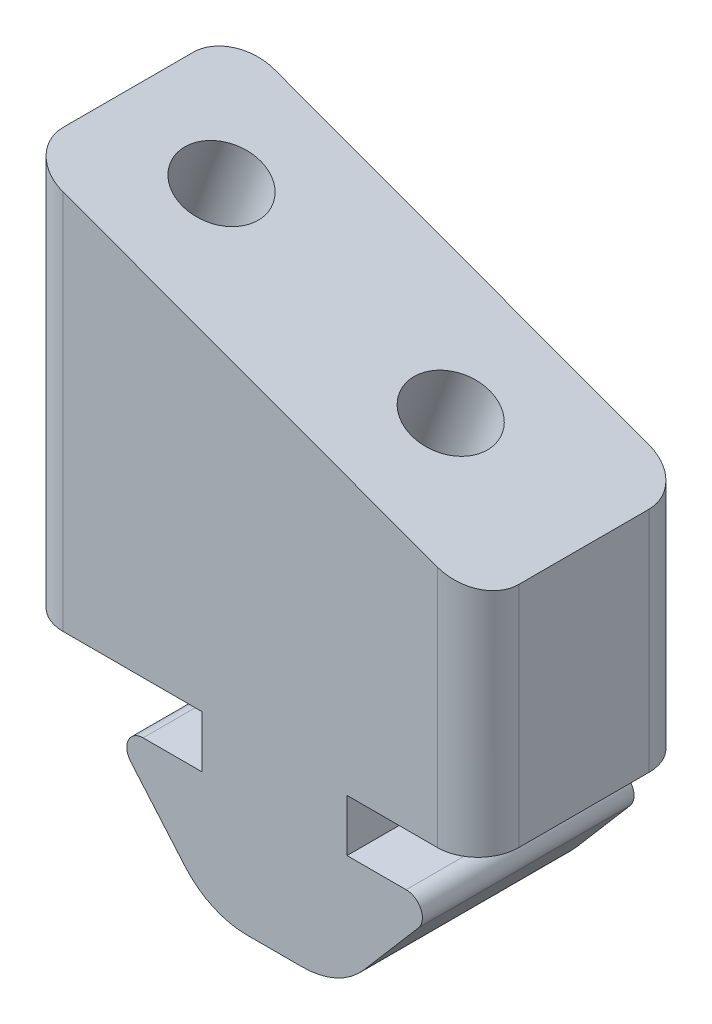
ISO-10303-21;
HEADER;
FILE_DESCRIPTION(('STEP AP214'),'2;1');
FILE_NAME('part.step','',(''),(''),'','','');
FILE_SCHEMA(('AUTOMOTIVE_DESIGN { 1 0 10303 214 1 1 1 1 }'));
ENDSEC;
DATA;
#1=APPLICATION_CONTEXT('core data for automotive mechanical design processes');
#2=APPLICATION_PROTOCOL_DEFINITION('international standard','automotive_design',2000,#1);
#3=PRODUCT_CONTEXT('',#1,'mechanical');
#4=PRODUCT('Part','Part','',(#3));
#5=PRODUCT_RELATED_PRODUCT_CATEGORY('part','',(#4));
#6=PRODUCT_DEFINITION_FORMATION('','',#4);
#7=PRODUCT_DEFINITION_CONTEXT('part definition',#1,'design');
#8=PRODUCT_DEFINITION('design','',#6,#7);
#9=PRODUCT_DEFINITION_SHAPE('','',#8);
#10=(LENGTH_UNIT() NAMED_UNIT(*) SI_UNIT(.MILLI.,.METRE.));
#11=(NAMED_UNIT(*) PLANE_ANGLE_UNIT() SI_UNIT($,.RADIAN.));
#12=(NAMED_UNIT(*) SI_UNIT($,.STERADIAN.) SOLID_ANGLE_UNIT());
#13=UNCERTAINTY_MEASURE_WITH_UNIT(LENGTH_MEASURE(1.E-05),#10,'distance_accuracy_value','');
#14=(GEOMETRIC_REPRESENTATION_CONTEXT(3) GLOBAL_UNCERTAINTY_ASSIGNED_CONTEXT((#13)) GLOBAL_UNIT_ASSIGNED_CONTEXT((#10,
#11,#12)) REPRESENTATION_CONTEXT('',''));
#15=CARTESIAN_POINT('',(0.,0.,0.));
#16=DIRECTION('',(0.,0.,1.));
#17=DIRECTION('',(1.,0.,0.));
#18=AXIS2_PLACEMENT_3D('',#15,#16,#17);
#19=CARTESIAN_POINT('',(12.5,0.,13.));
#20=DIRECTION('',(1.,0.,0.));
#21=DIRECTION('',(0.,1.,0.));
#22=AXIS2_PLACEMENT_3D('',#19,#20,#21);
#23=PLANE('',#22);
#24=DIRECTION('',(0.,0.,-1.));
#25=VECTOR('',#24,1.);
#26=CARTESIAN_POINT('',(12.5,10.5,13.));
#27=LINE('',#26,#25);
#28=CARTESIAN_POINT('',(12.5,10.5,10.5));
#29=VERTEX_POINT('',#28);
#30=CARTESIAN_POINT('',(12.5,10.5,2.5));
#31=VERTEX_POINT('',#30);
#32=EDGE_CURVE('E246',#29,#31,#27,.T.);
#33=ORIENTED_EDGE('',*,*,#32,.T.);
#34=DIRECTION('',(0.,-1.,0.));
#35=VECTOR('',#34,1.);
#36=CARTESIAN_POINT('',(12.5,24.5,2.5));
#37=LINE('',#36,#35);
#38=CARTESIAN_POINT('',(12.5,24.5,2.5));
#39=VERTEX_POINT('',#38);
#40=EDGE_CURVE('E11',#31,#39,#37,.F.);
#41=ORIENTED_EDGE('',*,*,#40,.T.);
#42=DIRECTION('',(0.,0.,-1.));
#43=VECTOR('',#42,1.);
#44=CARTESIAN_POINT('',(12.5,24.5,13.));
#45=LINE('',#44,#43);
#46=CARTESIAN_POINT('',(12.5,24.5,10.5));
#47=VERTEX_POINT('',#46);
#48=EDGE_CURVE('E260',#47,#39,#45,.T.);
#49=ORIENTED_EDGE('',*,*,#48,.F.);
#50=DIRECTION('',(0.,-1.,0.));
#51=VECTOR('',#50,1.);
#52=CARTESIAN_POINT('',(12.5,0.,10.5));
#53=LINE('',#52,#51);
#54=EDGE_CURVE('E49',#47,#29,#53,.T.);
#55=ORIENTED_EDGE('',*,*,#54,.T.);
#56=EDGE_LOOP('',(#33,#41,#49,#55));
#57=FACE_BOUND('',#56,.T.);
#58=ADVANCED_FACE('F41',(#57),#23,.T.);
#59=CARTESIAN_POINT('',(9.43154275407249,25.6291922665013,13.));
#60=DIRECTION('',(0.345357414020893,0.938471233752426,0.));
#61=DIRECTION('',(-0.938471233752427,0.345357414020893,0.));
#62=AXIS2_PLACEMENT_3D('',#59,#60,#61);
#63=PLANE('',#62);
#64=CARTESIAN_POINT('',(-9.76024639637212,32.6917706738649,6.5));
#65=DIRECTION('',(0.345357414020893,0.938471233752427,0.));
#66=DIRECTION('',(-0.938471233752427,0.345357414020893,0.));
#67=AXIS2_PLACEMENT_3D('',#64,#65,#66);
#68=CIRCLE('',#67,2.4);
#69=CARTESIAN_POINT('',(-12.0125773573779,33.5206284675151,6.5));
#70=VERTEX_POINT('',#69);
#71=EDGE_CURVE('E349',#70,#70,#68,.T.);
#72=ORIENTED_EDGE('',*,*,#71,.F.);
#73=EDGE_LOOP('',(#72));
#74=FACE_BOUND('',#73,.T.);
#75=CARTESIAN_POINT('',(4.31682210991428,27.5114094635516,6.5));
#76=DIRECTION('',(0.345357414020893,0.938471233752427,0.));
#77=DIRECTION('',(-0.938471233752427,0.345357414020893,0.));
#78=AXIS2_PLACEMENT_3D('',#75,#76,#77);
#79=CIRCLE('',#78,2.4);
#80=CARTESIAN_POINT('',(2.06449114890845,28.3402672572017,6.5));
#81=VERTEX_POINT('',#80);
#82=EDGE_CURVE('E346',#81,#81,#79,.T.);
#83=ORIENTED_EDGE('',*,*,#82,.F.);
#84=EDGE_LOOP('',(#83));
#85=FACE_BOUND('',#84,.T.);
#86=DIRECTION('',(0.,0.,-1.));
#87=VECTOR('',#86,1.);
#88=CARTESIAN_POINT('',(-15.5,34.804,13.));
#89=LINE('',#88,#87);
#90=CARTESIAN_POINT('',(-15.5,34.804,10.5));
#91=VERTEX_POINT('',#90);
#92=CARTESIAN_POINT('',(-15.5,34.804,2.5));
#93=VERTEX_POINT('',#92);
#94=EDGE_CURVE('E257',#91,#93,#89,.T.);
#95=ORIENTED_EDGE('',*,*,#94,.F.);
#96=CARTESIAN_POINT('',(-13.,33.884,10.5));
#97=DIRECTION('',(0.345357414020893,0.938471233752426,0.));
#98=DIRECTION('',(-0.938471233752427,0.345357414020893,0.));
#99=AXIS2_PLACEMENT_3D('',#96,#97,#98);
#100=ELLIPSE('',#99,2.66390690528029,2.5);
#101=CARTESIAN_POINT('',(-13.,33.884,13.));
#102=VERTEX_POINT('',#101);
#103=EDGE_CURVE('E312',#91,#102,#100,.T.);
#104=ORIENTED_EDGE('',*,*,#103,.T.);
#105=DIRECTION('',(0.938471233752427,-0.345357414020893,0.));
#106=VECTOR('',#105,1.);
#107=CARTESIAN_POINT('',(9.43154275407249,25.6291922665013,13.));
#108=LINE('',#107,#106);
#109=CARTESIAN_POINT('',(10.,25.42,13.));
#110=VERTEX_POINT('',#109);
#111=EDGE_CURVE('E190',#102,#110,#108,.T.);
#112=ORIENTED_EDGE('',*,*,#111,.T.);
#113=CARTESIAN_POINT('',(10.,25.42,10.5));
#114=DIRECTION('',(0.345357414020893,0.938471233752426,0.));
#115=DIRECTION('',(0.938471233752427,-0.345357414020893,0.));
#116=AXIS2_PLACEMENT_3D('',#113,#114,#115);
#117=ELLIPSE('',#116,2.66390690528029,2.5);
#118=EDGE_CURVE('E306',#110,#47,#117,.T.);
#119=ORIENTED_EDGE('',*,*,#118,.T.);
#120=ORIENTED_EDGE('',*,*,#48,.T.);
#121=CARTESIAN_POINT('',(10.,25.42,2.5));
#122=DIRECTION('',(0.345357414020893,0.938471233752426,0.));
#123=DIRECTION('',(-0.938471233752427,0.345357414020893,0.));
#124=AXIS2_PLACEMENT_3D('',#121,#122,#123);
#125=ELLIPSE('',#124,2.66390690528029,2.5);
#126=CARTESIAN_POINT('',(10.,25.42,0.));
#127=VERTEX_POINT('',#126);
#128=EDGE_CURVE('E308',#39,#127,#125,.T.);
#129=ORIENTED_EDGE('',*,*,#128,.T.);
#130=DIRECTION('',(0.938471233752427,-0.345357414020893,0.));
#131=VECTOR('',#130,1.);
#132=CARTESIAN_POINT('',(9.43154275407249,25.6291922665013,0.));
#133=LINE('',#132,#131);
#134=CARTESIAN_POINT('',(-13.,33.884,0.));
#135=VERTEX_POINT('',#134);
#136=EDGE_CURVE('E223',#135,#127,#133,.T.);
#137=ORIENTED_EDGE('',*,*,#136,.F.);
#138=CARTESIAN_POINT('',(-13.,33.884,2.5));
#139=DIRECTION('',(0.345357414020893,0.938471233752426,0.));
#140=DIRECTION('',(0.938471233752427,-0.345357414020893,0.));
#141=AXIS2_PLACEMENT_3D('',#138,#139,#140);
#142=ELLIPSE('',#141,2.66390690528029,2.5);
#143=EDGE_CURVE('E310',#135,#93,#142,.T.);
#144=ORIENTED_EDGE('',*,*,#143,.T.);
#145=EDGE_LOOP('',(#95,#104,#112,#119,#120,#129,#137,#144));
#146=FACE_BOUND('',#145,.T.);
#147=ADVANCED_FACE('F340',(#74,#85,#146),#63,.T.);
#148=CARTESIAN_POINT('',(-15.5,0.,13.));
#149=DIRECTION('',(-1.,0.,0.));
#150=DIRECTION('',(0.,0.,1.));
#151=AXIS2_PLACEMENT_3D('',#148,#149,#150);
#152=PLANE('',#151);
#153=DIRECTION('',(0.,0.,-1.));
#154=VECTOR('',#153,1.);
#155=CARTESIAN_POINT('',(-15.5,10.5,13.));
#156=LINE('',#155,#154);
#157=CARTESIAN_POINT('',(-15.5,10.5,10.5));
#158=VERTEX_POINT('',#157);
#159=CARTESIAN_POINT('',(-15.5,10.5,2.5));
#160=VERTEX_POINT('',#159);
#161=EDGE_CURVE('E200',#158,#160,#156,.T.);
#162=ORIENTED_EDGE('',*,*,#161,.F.);
#163=DIRECTION('',(0.,1.,0.));
#164=VECTOR('',#163,1.);
#165=CARTESIAN_POINT('',(-15.5,0.,10.5));
#166=LINE('',#165,#164);
#167=EDGE_CURVE('E303',#158,#91,#166,.T.);
#168=ORIENTED_EDGE('',*,*,#167,.T.);
#169=ORIENTED_EDGE('',*,*,#94,.T.);
#170=DIRECTION('',(0.,1.,0.));
#171=VECTOR('',#170,1.);
#172=CARTESIAN_POINT('',(-15.5,10.5,2.5));
#173=LINE('',#172,#171);
#174=EDGE_CURVE('E301',#93,#160,#173,.F.);
#175=ORIENTED_EDGE('',*,*,#174,.T.);
#176=EDGE_LOOP('',(#162,#168,#169,#175));
#177=FACE_BOUND('',#176,.T.);
#178=ADVANCED_FACE('F366',(#177),#152,.T.);
#179=CARTESIAN_POINT('',(0.,10.5,13.));
#180=DIRECTION('',(0.,1.,0.));
#181=DIRECTION('',(-1.,0.,0.));
#182=AXIS2_PLACEMENT_3D('',#179,#180,#181);
#183=PLANE('',#182);
#184=DIRECTION('',(1.,0.,0.));
#185=VECTOR('',#184,1.);
#186=CARTESIAN_POINT('',(0.,10.5,13.));
#187=LINE('',#186,#185);
#188=CARTESIAN_POINT('',(-13.,10.5,13.));
#189=VERTEX_POINT('',#188);
#190=CARTESIAN_POINT('',(-4.45,10.5,13.));
#191=VERTEX_POINT('',#190);
#192=EDGE_CURVE('E178',#189,#191,#187,.T.);
#193=ORIENTED_EDGE('',*,*,#192,.F.);
#194=CARTESIAN_POINT('',(-13.,10.5,10.5));
#195=DIRECTION('',(0.,1.,0.));
#196=DIRECTION('',(-1.,0.,0.));
#197=AXIS2_PLACEMENT_3D('',#194,#195,#196);
#198=CIRCLE('',#197,2.5);
#199=EDGE_CURVE('E319',#189,#158,#198,.F.);
#200=ORIENTED_EDGE('',*,*,#199,.T.);
#201=ORIENTED_EDGE('',*,*,#161,.T.);
#202=CARTESIAN_POINT('',(-13.,10.5,2.5));
#203=DIRECTION('',(0.,1.,0.));
#204=DIRECTION('',(-1.,0.,0.));
#205=AXIS2_PLACEMENT_3D('',#202,#203,#204);
#206=CIRCLE('',#205,2.5);
#207=CARTESIAN_POINT('',(-13.,10.5,0.));
#208=VERTEX_POINT('',#207);
#209=EDGE_CURVE('E317',#160,#208,#206,.F.);
#210=ORIENTED_EDGE('',*,*,#209,.T.);
#211=DIRECTION('',(1.,0.,0.));
#212=VECTOR('',#211,1.);
#213=CARTESIAN_POINT('',(0.,10.5,0.));
#214=LINE('',#213,#212);
#215=CARTESIAN_POINT('',(-4.45,10.5,0.));
#216=VERTEX_POINT('',#215);
#217=EDGE_CURVE('E197',#208,#216,#214,.T.);
#218=ORIENTED_EDGE('',*,*,#217,.T.);
#219=DIRECTION('',(0.,0.,-1.));
#220=VECTOR('',#219,1.);
#221=CARTESIAN_POINT('',(-4.45,10.5,13.));
#222=LINE('',#221,#220);
#223=EDGE_CURVE('E194',#191,#216,#222,.T.);
#224=ORIENTED_EDGE('',*,*,#223,.F.);
#225=EDGE_LOOP('',(#193,#200,#201,#210,#218,#224));
#226=FACE_BOUND('',#225,.T.);
#227=ADVANCED_FACE('F195',(#226),#183,.F.);
#228=CARTESIAN_POINT('',(-4.45,0.,13.));
#229=DIRECTION('',(1.,0.,0.));
#230=DIRECTION('',(0.,1.,0.));
#231=AXIS2_PLACEMENT_3D('',#228,#229,#230);
#232=PLANE('',#231);
#233=DIRECTION('',(0.,-1.,0.));
#234=VECTOR('',#233,1.);
#235=CARTESIAN_POINT('',(-4.45,0.,0.));
#236=LINE('',#235,#234);
#237=CARTESIAN_POINT('',(-4.45,7.3,0.));
#238=VERTEX_POINT('',#237);
#239=EDGE_CURVE('E228',#216,#238,#236,.T.);
#240=ORIENTED_EDGE('',*,*,#239,.T.);
#241=DIRECTION('',(0.,0.,-1.));
#242=VECTOR('',#241,1.);
#243=CARTESIAN_POINT('',(-4.45,7.3,13.));
#244=LINE('',#243,#242);
#245=CARTESIAN_POINT('',(-4.45,7.3,13.));
#246=VERTEX_POINT('',#245);
#247=EDGE_CURVE('E201',#246,#238,#244,.T.);
#248=ORIENTED_EDGE('',*,*,#247,.F.);
#249=DIRECTION('',(0.,-1.,0.));
#250=VECTOR('',#249,1.);
#251=CARTESIAN_POINT('',(-4.45,0.,13.));
#252=LINE('',#251,#250);
#253=EDGE_CURVE('E184',#191,#246,#252,.T.);
#254=ORIENTED_EDGE('',*,*,#253,.F.);
#255=ORIENTED_EDGE('',*,*,#223,.T.);
#256=EDGE_LOOP('',(#240,#248,#254,#255));
#257=FACE_BOUND('',#256,.T.);
#258=ADVANCED_FACE('F203',(#257),#232,.F.);
#259=CARTESIAN_POINT('',(0.,7.3,13.));
#260=DIRECTION('',(0.,-1.,0.));
#261=DIRECTION('',(1.,0.,0.));
#262=AXIS2_PLACEMENT_3D('',#259,#260,#261);
#263=PLANE('',#262);
#264=DIRECTION('',(-1.,0.,0.));
#265=VECTOR('',#264,1.);
#266=CARTESIAN_POINT('',(0.,7.3,0.));
#267=LINE('',#266,#265);
#268=CARTESIAN_POINT('',(-8.07739440936548,7.3,0.));
#269=VERTEX_POINT('',#268);
#270=EDGE_CURVE('E231',#238,#269,#267,.T.);
#271=ORIENTED_EDGE('',*,*,#270,.T.);
#272=DIRECTION('',(0.,0.,-1.));
#273=VECTOR('',#272,1.);
#274=CARTESIAN_POINT('',(-8.07739440936548,7.3,13.));
#275=LINE('',#274,#273);
#276=CARTESIAN_POINT('',(-8.07739440936548,7.3,13.));
#277=VERTEX_POINT('',#276);
#278=EDGE_CURVE('E281',#269,#277,#275,.F.);
#279=ORIENTED_EDGE('',*,*,#278,.T.);
#280=DIRECTION('',(-1.,0.,0.));
#281=VECTOR('',#280,1.);
#282=CARTESIAN_POINT('',(0.,7.3,13.));
#283=LINE('',#282,#281);
#284=EDGE_CURVE('E206',#246,#277,#283,.T.);
#285=ORIENTED_EDGE('',*,*,#284,.F.);
#286=ORIENTED_EDGE('',*,*,#247,.T.);
#287=EDGE_LOOP('',(#271,#279,#285,#286));
#288=FACE_BOUND('',#287,.T.);
#289=ADVANCED_FACE('F435',(#288),#263,.F.);
#290=CARTESIAN_POINT('',(-2.30811293684524,-1.97612408976476,13.));
#291=DIRECTION('',(0.759623745160267,0.650362795513927,0.));
#292=DIRECTION('',(-0.650362795513927,0.759623745160267,0.));
#293=AXIS2_PLACEMENT_3D('',#290,#291,#292);
#294=PLANE('',#293);
#295=DIRECTION('',(0.650362795513927,-0.759623745160267,0.));
#296=VECTOR('',#295,1.);
#297=CARTESIAN_POINT('',(-2.30811293684524,-1.97612408976476,0.));
#298=LINE('',#297,#296);
#299=CARTESIAN_POINT('',(-8.83701815452575,5.64963720448607,0.));
#300=VERTEX_POINT('',#299);
#301=CARTESIAN_POINT('',(-5.49673460824518,1.74818602243036,0.));
#302=VERTEX_POINT('',#301);
#303=EDGE_CURVE('E234',#300,#302,#298,.T.);
#304=ORIENTED_EDGE('',*,*,#303,.T.);
#305=DIRECTION('',(0.,0.,-1.));
#306=VECTOR('',#305,1.);
#307=CARTESIAN_POINT('',(-5.49673460824518,1.74818602243036,13.));
#308=LINE('',#307,#306);
#309=CARTESIAN_POINT('',(-5.49673460824518,1.74818602243036,13.));
#310=VERTEX_POINT('',#309);
#311=EDGE_CURVE('E299',#302,#310,#308,.F.);
#312=ORIENTED_EDGE('',*,*,#311,.T.);
#313=DIRECTION('',(0.650362795513927,-0.759623745160267,0.));
#314=VECTOR('',#313,1.);
#315=CARTESIAN_POINT('',(-2.30811293684524,-1.97612408976476,13.));
#316=LINE('',#315,#314);
#317=CARTESIAN_POINT('',(-8.83701815452575,5.64963720448607,13.));
#318=VERTEX_POINT('',#317);
#319=EDGE_CURVE('E208',#318,#310,#316,.T.);
#320=ORIENTED_EDGE('',*,*,#319,.F.);
#321=DIRECTION('',(0.,0.,-1.));
#322=VECTOR('',#321,1.);
#323=CARTESIAN_POINT('',(-8.83701815452575,5.64963720448607,13.));
#324=LINE('',#323,#322);
#325=EDGE_CURVE('E278',#318,#300,#324,.T.);
#326=ORIENTED_EDGE('',*,*,#325,.T.);
#327=EDGE_LOOP('',(#304,#312,#320,#326));
#328=FACE_BOUND('',#327,.T.);
#329=ADVANCED_FACE('F438',(#328),#294,.F.);
#330=CARTESIAN_POINT('',(0.,0.,13.));
#331=DIRECTION('',(0.,1.,0.));
#332=DIRECTION('',(0.,0.,1.));
#333=AXIS2_PLACEMENT_3D('',#330,#331,#332);
#334=PLANE('',#333);
#335=DIRECTION('',(1.,0.,0.));
#336=VECTOR('',#335,1.);
#337=CARTESIAN_POINT('',(0.,0.,0.));
#338=LINE('',#337,#336);
#339=CARTESIAN_POINT('',(-1.69861588244384,0.,0.));
#340=VERTEX_POINT('',#339);
#341=CARTESIAN_POINT('',(1.69861588244384,0.,0.));
#342=VERTEX_POINT('',#341);
#343=EDGE_CURVE('E237',#340,#342,#338,.T.);
#344=ORIENTED_EDGE('',*,*,#343,.T.);
#345=DIRECTION('',(0.,0.,-1.));
#346=VECTOR('',#345,1.);
#347=CARTESIAN_POINT('',(1.69861588244384,0.,13.));
#348=LINE('',#347,#346);
#349=CARTESIAN_POINT('',(1.69861588244384,0.,13.));
#350=VERTEX_POINT('',#349);
#351=EDGE_CURVE('E293',#342,#350,#348,.F.);
#352=ORIENTED_EDGE('',*,*,#351,.T.);
#353=DIRECTION('',(1.,0.,0.));
#354=VECTOR('',#353,1.);
#355=CARTESIAN_POINT('',(0.,0.,13.));
#356=LINE('',#355,#354);
#357=CARTESIAN_POINT('',(-1.69861588244384,0.,13.));
#358=VERTEX_POINT('',#357);
#359=EDGE_CURVE('E214',#358,#350,#356,.T.);
#360=ORIENTED_EDGE('',*,*,#359,.F.);
#361=DIRECTION('',(0.,0.,-1.));
#362=VECTOR('',#361,1.);
#363=CARTESIAN_POINT('',(-1.69861588244384,0.,13.));
#364=LINE('',#363,#362);
#365=EDGE_CURVE('E290',#358,#340,#364,.T.);
#366=ORIENTED_EDGE('',*,*,#365,.T.);
#367=EDGE_LOOP('',(#344,#352,#360,#366));
#368=FACE_BOUND('',#367,.T.);
#369=ADVANCED_FACE('F442',(#368),#334,.F.);
#370=CARTESIAN_POINT('',(2.30811293684524,-1.97612408976476,13.));
#371=DIRECTION('',(-0.759623745160267,0.650362795513927,0.));
#372=DIRECTION('',(-0.650362795513927,-0.759623745160267,0.));
#373=AXIS2_PLACEMENT_3D('',#370,#371,#372);
#374=PLANE('',#373);
#375=DIRECTION('',(0.650362795513927,0.759623745160267,0.));
#376=VECTOR('',#375,1.);
#377=CARTESIAN_POINT('',(2.30811293684524,-1.97612408976476,13.));
#378=LINE('',#377,#376);
#379=CARTESIAN_POINT('',(5.49673460824518,1.74818602243037,13.));
#380=VERTEX_POINT('',#379);
#381=CARTESIAN_POINT('',(8.83701815452575,5.64963720448607,13.));
#382=VERTEX_POINT('',#381);
#383=EDGE_CURVE('E217',#380,#382,#378,.T.);
#384=ORIENTED_EDGE('',*,*,#383,.F.);
#385=DIRECTION('',(0.,0.,-1.));
#386=VECTOR('',#385,1.);
#387=CARTESIAN_POINT('',(5.49673460824518,1.74818602243036,13.));
#388=LINE('',#387,#386);
#389=CARTESIAN_POINT('',(5.49673460824518,1.74818602243037,0.));
#390=VERTEX_POINT('',#389);
#391=EDGE_CURVE('E283',#380,#390,#388,.T.);
#392=ORIENTED_EDGE('',*,*,#391,.T.);
#393=DIRECTION('',(0.650362795513927,0.759623745160267,0.));
#394=VECTOR('',#393,1.);
#395=CARTESIAN_POINT('',(2.30811293684524,-1.97612408976476,0.));
#396=LINE('',#395,#394);
#397=CARTESIAN_POINT('',(8.83701815452575,5.64963720448607,0.));
#398=VERTEX_POINT('',#397);
#399=EDGE_CURVE('E240',#390,#398,#396,.T.);
#400=ORIENTED_EDGE('',*,*,#399,.T.);
#401=DIRECTION('',(0.,0.,-1.));
#402=VECTOR('',#401,1.);
#403=CARTESIAN_POINT('',(8.83701815452575,5.64963720448607,13.));
#404=LINE('',#403,#402);
#405=EDGE_CURVE('E271',#398,#382,#404,.F.);
#406=ORIENTED_EDGE('',*,*,#405,.T.);
#407=EDGE_LOOP('',(#384,#392,#400,#406));
#408=FACE_BOUND('',#407,.T.);
#409=ADVANCED_FACE('F446',(#408),#374,.F.);
#410=CARTESIAN_POINT('',(0.,7.3,13.));
#411=DIRECTION('',(0.,-1.,0.));
#412=DIRECTION('',(1.,0.,0.));
#413=AXIS2_PLACEMENT_3D('',#410,#411,#412);
#414=PLANE('',#413);
#415=DIRECTION('',(-1.,0.,0.));
#416=VECTOR('',#415,1.);
#417=CARTESIAN_POINT('',(0.,7.3,13.));
#418=LINE('',#417,#416);
#419=CARTESIAN_POINT('',(8.07739440936548,7.3,13.));
#420=VERTEX_POINT('',#419);
#421=CARTESIAN_POINT('',(4.45,7.3,13.));
#422=VERTEX_POINT('',#421);
#423=EDGE_CURVE('E219',#420,#422,#418,.T.);
#424=ORIENTED_EDGE('',*,*,#423,.F.);
#425=DIRECTION('',(0.,0.,-1.));
#426=VECTOR('',#425,1.);
#427=CARTESIAN_POINT('',(8.07739440936548,7.3,13.));
#428=LINE('',#427,#426);
#429=CARTESIAN_POINT('',(8.07739440936548,7.3,0.));
#430=VERTEX_POINT('',#429);
#431=EDGE_CURVE('E263',#420,#430,#428,.T.);
#432=ORIENTED_EDGE('',*,*,#431,.T.);
#433=DIRECTION('',(-1.,0.,0.));
#434=VECTOR('',#433,1.);
#435=CARTESIAN_POINT('',(0.,7.3,0.));
#436=LINE('',#435,#434);
#437=CARTESIAN_POINT('',(4.45,7.3,0.));
#438=VERTEX_POINT('',#437);
#439=EDGE_CURVE('E242',#430,#438,#436,.T.);
#440=ORIENTED_EDGE('',*,*,#439,.T.);
#441=DIRECTION('',(0.,0.,-1.));
#442=VECTOR('',#441,1.);
#443=CARTESIAN_POINT('',(4.45,7.3,13.));
#444=LINE('',#443,#442);
#445=EDGE_CURVE('E251',#422,#438,#444,.T.);
#446=ORIENTED_EDGE('',*,*,#445,.F.);
#447=EDGE_LOOP('',(#424,#432,#440,#446));
#448=FACE_BOUND('',#447,.T.);
#449=ADVANCED_FACE('F450',(#448),#414,.F.);
#450=CARTESIAN_POINT('',(4.45,0.,13.));
#451=DIRECTION('',(-1.,0.,0.));
#452=DIRECTION('',(0.,-1.,0.));
#453=AXIS2_PLACEMENT_3D('',#450,#451,#452);
#454=PLANE('',#453);
#455=DIRECTION('',(0.,1.,0.));
#456=VECTOR('',#455,1.);
#457=CARTESIAN_POINT('',(4.45,0.,0.));
#458=LINE('',#457,#456);
#459=CARTESIAN_POINT('',(4.45,10.5,0.));
#460=VERTEX_POINT('',#459);
#461=EDGE_CURVE('E244',#438,#460,#458,.T.);
#462=ORIENTED_EDGE('',*,*,#461,.T.);
#463=DIRECTION('',(0.,0.,-1.));
#464=VECTOR('',#463,1.);
#465=CARTESIAN_POINT('',(4.45,10.5,13.));
#466=LINE('',#465,#464);
#467=CARTESIAN_POINT('',(4.45,10.5,13.));
#468=VERTEX_POINT('',#467);
#469=EDGE_CURVE('E248',#468,#460,#466,.T.);
#470=ORIENTED_EDGE('',*,*,#469,.F.);
#471=DIRECTION('',(0.,1.,0.));
#472=VECTOR('',#471,1.);
#473=CARTESIAN_POINT('',(4.45,0.,13.));
#474=LINE('',#473,#472);
#475=EDGE_CURVE('E221',#422,#468,#474,.T.);
#476=ORIENTED_EDGE('',*,*,#475,.F.);
#477=ORIENTED_EDGE('',*,*,#445,.T.);
#478=EDGE_LOOP('',(#462,#470,#476,#477));
#479=FACE_BOUND('',#478,.T.);
#480=ADVANCED_FACE('F454',(#479),#454,.F.);
#481=CARTESIAN_POINT('',(10.,10.5,0.));
#482=VERTEX_POINT('',#481);
#483=EDGE_CURVE('E229',#460,#482,#214,.T.);
#484=ORIENTED_EDGE('',*,*,#483,.T.);
#485=CARTESIAN_POINT('',(10.,10.5,2.5));
#486=DIRECTION('',(0.,1.,0.));
#487=DIRECTION('',(-1.,0.,0.));
#488=AXIS2_PLACEMENT_3D('',#485,#486,#487);
#489=CIRCLE('',#488,2.5);
#490=EDGE_CURVE('E56',#482,#31,#489,.F.);
#491=ORIENTED_EDGE('',*,*,#490,.T.);
#492=ORIENTED_EDGE('',*,*,#32,.F.);
#493=CARTESIAN_POINT('',(10.,10.5,10.5));
#494=DIRECTION('',(0.,1.,0.));
#495=DIRECTION('',(-1.,0.,0.));
#496=AXIS2_PLACEMENT_3D('',#493,#494,#495);
#497=CIRCLE('',#496,2.5);
#498=CARTESIAN_POINT('',(10.,10.5,13.));
#499=VERTEX_POINT('',#498);
#500=EDGE_CURVE('E64',#29,#499,#497,.F.);
#501=ORIENTED_EDGE('',*,*,#500,.T.);
#502=EDGE_CURVE('E192',#468,#499,#187,.T.);
#503=ORIENTED_EDGE('',*,*,#502,.F.);
#504=ORIENTED_EDGE('',*,*,#469,.T.);
#505=EDGE_LOOP('',(#484,#491,#492,#501,#503,#504));
#506=FACE_BOUND('',#505,.T.);
#507=ADVANCED_FACE('F332',(#506),#183,.F.);
#508=CARTESIAN_POINT('',(0.,0.,13.));
#509=DIRECTION('',(0.,0.,1.));
#510=DIRECTION('',(1.,0.,0.));
#511=AXIS2_PLACEMENT_3D('',#508,#509,#510);
#512=PLANE('',#511);
#513=ORIENTED_EDGE('',*,*,#111,.F.);
#514=DIRECTION('',(0.,1.,0.));
#515=VECTOR('',#514,1.);
#516=CARTESIAN_POINT('',(-13.,0.,13.));
#517=LINE('',#516,#515);
#518=EDGE_CURVE('E187',#102,#189,#517,.F.);
#519=ORIENTED_EDGE('',*,*,#518,.T.);
#520=ORIENTED_EDGE('',*,*,#192,.T.);
#521=ORIENTED_EDGE('',*,*,#253,.T.);
#522=ORIENTED_EDGE('',*,*,#284,.T.);
#523=CARTESIAN_POINT('',(-8.07739440936548,6.3,13.));
#524=DIRECTION('',(0.,0.,1.));
#525=DIRECTION('',(1.,0.,0.));
#526=AXIS2_PLACEMENT_3D('',#523,#524,#525);
#527=CIRCLE('',#526,1.);
#528=EDGE_CURVE('E274',#277,#318,#527,.T.);
#529=ORIENTED_EDGE('',*,*,#528,.T.);
#530=ORIENTED_EDGE('',*,*,#319,.T.);
#531=CARTESIAN_POINT('',(-1.69861588244384,5.,13.));
#532=DIRECTION('',(0.,0.,1.));
#533=DIRECTION('',(1.,0.,0.));
#534=AXIS2_PLACEMENT_3D('',#531,#532,#533);
#535=CIRCLE('',#534,5.);
#536=EDGE_CURVE('E295',#310,#358,#535,.T.);
#537=ORIENTED_EDGE('',*,*,#536,.T.);
#538=ORIENTED_EDGE('',*,*,#359,.T.);
#539=CARTESIAN_POINT('',(1.69861588244384,5.,13.));
#540=DIRECTION('',(0.,0.,1.));
#541=DIRECTION('',(1.,0.,0.));
#542=AXIS2_PLACEMENT_3D('',#539,#540,#541);
#543=CIRCLE('',#542,5.);
#544=EDGE_CURVE('E297',#350,#380,#543,.T.);
#545=ORIENTED_EDGE('',*,*,#544,.T.);
#546=ORIENTED_EDGE('',*,*,#383,.T.);
#547=CARTESIAN_POINT('',(8.07739440936548,6.3,13.));
#548=DIRECTION('',(0.,0.,1.));
#549=DIRECTION('',(1.,0.,0.));
#550=AXIS2_PLACEMENT_3D('',#547,#548,#549);
#551=CIRCLE('',#550,1.);
#552=EDGE_CURVE('E276',#382,#420,#551,.T.);
#553=ORIENTED_EDGE('',*,*,#552,.T.);
#554=ORIENTED_EDGE('',*,*,#423,.T.);
#555=ORIENTED_EDGE('',*,*,#475,.T.);
#556=ORIENTED_EDGE('',*,*,#502,.T.);
#557=DIRECTION('',(0.,-1.,0.));
#558=VECTOR('',#557,1.);
#559=CARTESIAN_POINT('',(10.,0.,13.));
#560=LINE('',#559,#558);
#561=EDGE_CURVE('E314',#499,#110,#560,.F.);
#562=ORIENTED_EDGE('',*,*,#561,.T.);
#563=EDGE_LOOP('',(#513,#519,#520,#521,#522,#529,#530,#537,#538,#545,#546,#553,#554,#555,#556,#562));
#564=FACE_BOUND('',#563,.T.);
#565=ADVANCED_FACE('F181',(#564),#512,.T.);
#566=CARTESIAN_POINT('',(0.,0.,0.));
#567=DIRECTION('',(0.,0.,1.));
#568=DIRECTION('',(1.,0.,0.));
#569=AXIS2_PLACEMENT_3D('',#566,#567,#568);
#570=PLANE('',#569);
#571=ORIENTED_EDGE('',*,*,#217,.F.);
#572=DIRECTION('',(0.,1.,0.));
#573=VECTOR('',#572,1.);
#574=CARTESIAN_POINT('',(-13.,34.804,0.));
#575=LINE('',#574,#573);
#576=EDGE_CURVE('E324',#208,#135,#575,.T.);
#577=ORIENTED_EDGE('',*,*,#576,.T.);
#578=ORIENTED_EDGE('',*,*,#136,.T.);
#579=DIRECTION('',(0.,-1.,0.));
#580=VECTOR('',#579,1.);
#581=CARTESIAN_POINT('',(10.,10.5,0.));
#582=LINE('',#581,#580);
#583=EDGE_CURVE('E321',#127,#482,#582,.T.);
#584=ORIENTED_EDGE('',*,*,#583,.T.);
#585=ORIENTED_EDGE('',*,*,#483,.F.);
#586=ORIENTED_EDGE('',*,*,#461,.F.);
#587=ORIENTED_EDGE('',*,*,#439,.F.);
#588=CARTESIAN_POINT('',(8.07739440936548,6.3,0.));
#589=DIRECTION('',(0.,0.,1.));
#590=DIRECTION('',(1.,0.,0.));
#591=AXIS2_PLACEMENT_3D('',#588,#589,#590);
#592=CIRCLE('',#591,1.);
#593=EDGE_CURVE('E268',#430,#398,#592,.F.);
#594=ORIENTED_EDGE('',*,*,#593,.T.);
#595=ORIENTED_EDGE('',*,*,#399,.F.);
#596=CARTESIAN_POINT('',(1.69861588244384,5.,0.));
#597=DIRECTION('',(0.,0.,1.));
#598=DIRECTION('',(1.,0.,0.));
#599=AXIS2_PLACEMENT_3D('',#596,#597,#598);
#600=CIRCLE('',#599,5.);
#601=EDGE_CURVE('E288',#390,#342,#600,.F.);
#602=ORIENTED_EDGE('',*,*,#601,.T.);
#603=ORIENTED_EDGE('',*,*,#343,.F.);
#604=CARTESIAN_POINT('',(-1.69861588244384,5.,0.));
#605=DIRECTION('',(0.,0.,1.));
#606=DIRECTION('',(1.,0.,0.));
#607=AXIS2_PLACEMENT_3D('',#604,#605,#606);
#608=CIRCLE('',#607,5.);
#609=EDGE_CURVE('E286',#340,#302,#608,.F.);
#610=ORIENTED_EDGE('',*,*,#609,.T.);
#611=ORIENTED_EDGE('',*,*,#303,.F.);
#612=CARTESIAN_POINT('',(-8.07739440936548,6.3,0.));
#613=DIRECTION('',(0.,0.,1.));
#614=DIRECTION('',(1.,0.,0.));
#615=AXIS2_PLACEMENT_3D('',#612,#613,#614);
#616=CIRCLE('',#615,1.);
#617=EDGE_CURVE('E266',#300,#269,#616,.F.);
#618=ORIENTED_EDGE('',*,*,#617,.T.);
#619=ORIENTED_EDGE('',*,*,#270,.F.);
#620=ORIENTED_EDGE('',*,*,#239,.F.);
#621=EDGE_LOOP('',(#571,#577,#578,#584,#585,#586,#587,#594,#595,#602,#603,#610,#611,#618,#619,#620));
#622=FACE_BOUND('',#621,.T.);
#623=ADVANCED_FACE('F396',(#622),#570,.F.);
#624=CARTESIAN_POINT('',(8.07739440936548,6.3,13.));
#625=DIRECTION('',(0.,0.,-1.));
#626=DIRECTION('',(-1.,0.,0.));
#627=AXIS2_PLACEMENT_3D('',#624,#625,#626);
#628=CYLINDRICAL_SURFACE('',#627,1.);
#629=ORIENTED_EDGE('',*,*,#552,.F.);
#630=ORIENTED_EDGE('',*,*,#405,.F.);
#631=ORIENTED_EDGE('',*,*,#593,.F.);
#632=ORIENTED_EDGE('',*,*,#431,.F.);
#633=EDGE_LOOP('',(#629,#630,#631,#632));
#634=FACE_BOUND('',#633,.T.);
#635=ADVANCED_FACE('F392',(#634),#628,.T.);
#636=CARTESIAN_POINT('',(-8.07739440936548,6.3,13.));
#637=DIRECTION('',(0.,0.,-1.));
#638=DIRECTION('',(-1.,0.,0.));
#639=AXIS2_PLACEMENT_3D('',#636,#637,#638);
#640=CYLINDRICAL_SURFACE('',#639,1.);
#641=ORIENTED_EDGE('',*,*,#528,.F.);
#642=ORIENTED_EDGE('',*,*,#278,.F.);
#643=ORIENTED_EDGE('',*,*,#617,.F.);
#644=ORIENTED_EDGE('',*,*,#325,.F.);
#645=EDGE_LOOP('',(#641,#642,#643,#644));
#646=FACE_BOUND('',#645,.T.);
#647=ADVANCED_FACE('F395',(#646),#640,.T.);
#648=CARTESIAN_POINT('',(1.69861588244384,5.,13.));
#649=DIRECTION('',(0.,0.,-1.));
#650=DIRECTION('',(-1.,0.,0.));
#651=AXIS2_PLACEMENT_3D('',#648,#649,#650);
#652=CYLINDRICAL_SURFACE('',#651,5.);
#653=ORIENTED_EDGE('',*,*,#544,.F.);
#654=ORIENTED_EDGE('',*,*,#351,.F.);
#655=ORIENTED_EDGE('',*,*,#601,.F.);
#656=ORIENTED_EDGE('',*,*,#391,.F.);
#657=EDGE_LOOP('',(#653,#654,#655,#656));
#658=FACE_BOUND('',#657,.T.);
#659=ADVANCED_FACE('F381',(#658),#652,.T.);
#660=CARTESIAN_POINT('',(-1.69861588244384,5.,13.));
#661=DIRECTION('',(0.,0.,-1.));
#662=DIRECTION('',(-1.,0.,0.));
#663=AXIS2_PLACEMENT_3D('',#660,#661,#662);
#664=CYLINDRICAL_SURFACE('',#663,5.);
#665=ORIENTED_EDGE('',*,*,#536,.F.);
#666=ORIENTED_EDGE('',*,*,#311,.F.);
#667=ORIENTED_EDGE('',*,*,#609,.F.);
#668=ORIENTED_EDGE('',*,*,#365,.F.);
#669=EDGE_LOOP('',(#665,#666,#667,#668));
#670=FACE_BOUND('',#669,.T.);
#671=ADVANCED_FACE('F372',(#670),#664,.T.);
#672=CARTESIAN_POINT('',(1.72664150475758,20.4728752104084,6.5));
#673=DIRECTION('',(0.345357414020893,0.938471233752427,0.));
#674=DIRECTION('',(-0.938471233752427,0.345357414020893,0.));
#675=AXIS2_PLACEMENT_3D('',#672,#673,#674);
#676=CYLINDRICAL_SURFACE('',#675,2.4);
#677=CARTESIAN_POINT('',(1.72664150475758,20.4728752104084,6.5));
#678=DIRECTION('',(0.345357414020893,0.938471233752427,0.));
#679=DIRECTION('',(-0.938471233752427,0.345357414020893,0.));
#680=AXIS2_PLACEMENT_3D('',#677,#678,#679);
#681=CIRCLE('',#680,2.4);
#682=CARTESIAN_POINT('',(-0.525689456248242,21.3017330040585,6.5));
#683=VERTEX_POINT('',#682);
#684=EDGE_CURVE('E343',#683,#683,#681,.T.);
#685=ORIENTED_EDGE('',*,*,#684,.F.);
#686=EDGE_LOOP('',(#685));
#687=FACE_BOUND('',#686,.T.);
#688=ORIENTED_EDGE('',*,*,#82,.T.);
#689=EDGE_LOOP('',(#688));
#690=FACE_BOUND('',#689,.T.);
#691=ADVANCED_FACE('F370',(#687,#690),#676,.F.);
#692=CARTESIAN_POINT('',(1.72664150475758,20.4728752104084,6.5));
#693=DIRECTION('',(0.345357414020893,0.938471233752427,0.));
#694=DIRECTION('',(-0.938471233752427,0.345357414020893,0.));
#695=AXIS2_PLACEMENT_3D('',#692,#693,#694);
#696=PLANE('',#695);
#697=ORIENTED_EDGE('',*,*,#684,.T.);
#698=EDGE_LOOP('',(#697));
#699=FACE_BOUND('',#698,.T.);
#700=ADVANCED_FACE('F360',(#699),#696,.T.);
#701=CARTESIAN_POINT('',(-12.3504270015288,25.6532364207217,6.5));
#702=DIRECTION('',(0.345357414020893,0.938471233752427,0.));
#703=DIRECTION('',(-0.938471233752427,0.345357414020893,0.));
#704=AXIS2_PLACEMENT_3D('',#701,#702,#703);
#705=CYLINDRICAL_SURFACE('',#704,2.4);
#706=CARTESIAN_POINT('',(-12.3504270015288,25.6532364207217,6.5));
#707=DIRECTION('',(0.345357414020893,0.938471233752427,0.));
#708=DIRECTION('',(-0.938471233752427,0.345357414020893,0.));
#709=AXIS2_PLACEMENT_3D('',#706,#707,#708);
#710=CIRCLE('',#709,2.4);
#711=CARTESIAN_POINT('',(-14.6027579625346,26.4820942143719,6.5));
#712=VERTEX_POINT('',#711);
#713=EDGE_CURVE('E226',#712,#712,#710,.T.);
#714=ORIENTED_EDGE('',*,*,#713,.F.);
#715=EDGE_LOOP('',(#714));
#716=FACE_BOUND('',#715,.T.);
#717=ORIENTED_EDGE('',*,*,#71,.T.);
#718=EDGE_LOOP('',(#717));
#719=FACE_BOUND('',#718,.T.);
#720=ADVANCED_FACE('F357',(#716,#719),#705,.F.);
#721=CARTESIAN_POINT('',(-12.3504270015288,25.6532364207217,6.5));
#722=DIRECTION('',(0.345357414020893,0.938471233752427,0.));
#723=DIRECTION('',(-0.938471233752427,0.345357414020893,0.));
#724=AXIS2_PLACEMENT_3D('',#721,#722,#723);
#725=PLANE('',#724);
#726=ORIENTED_EDGE('',*,*,#713,.T.);
#727=EDGE_LOOP('',(#726));
#728=FACE_BOUND('',#727,.T.);
#729=ADVANCED_FACE('F355',(#728),#725,.T.);
#730=CARTESIAN_POINT('',(-13.,0.,10.5));
#731=DIRECTION('',(0.,1.,0.));
#732=DIRECTION('',(0.,0.,1.));
#733=AXIS2_PLACEMENT_3D('',#730,#731,#732);
#734=CYLINDRICAL_SURFACE('',#733,2.5);
#735=ORIENTED_EDGE('',*,*,#199,.F.);
#736=ORIENTED_EDGE('',*,*,#518,.F.);
#737=ORIENTED_EDGE('',*,*,#103,.F.);
#738=ORIENTED_EDGE('',*,*,#167,.F.);
#739=EDGE_LOOP('',(#735,#736,#737,#738));
#740=FACE_BOUND('',#739,.T.);
#741=ADVANCED_FACE('F404',(#740),#734,.T.);
#742=CARTESIAN_POINT('',(-13.,0.,2.5));
#743=DIRECTION('',(0.,-1.,0.));
#744=DIRECTION('',(0.,0.,-1.));
#745=AXIS2_PLACEMENT_3D('',#742,#743,#744);
#746=CYLINDRICAL_SURFACE('',#745,2.5);
#747=ORIENTED_EDGE('',*,*,#209,.F.);
#748=ORIENTED_EDGE('',*,*,#174,.F.);
#749=ORIENTED_EDGE('',*,*,#143,.F.);
#750=ORIENTED_EDGE('',*,*,#576,.F.);
#751=EDGE_LOOP('',(#747,#748,#749,#750));
#752=FACE_BOUND('',#751,.T.);
#753=ADVANCED_FACE('F407',(#752),#746,.T.);
#754=CARTESIAN_POINT('',(10.,0.,2.5));
#755=DIRECTION('',(0.,1.,0.));
#756=DIRECTION('',(-1.,0.,0.));
#757=AXIS2_PLACEMENT_3D('',#754,#755,#756);
#758=CYLINDRICAL_SURFACE('',#757,2.5);
#759=ORIENTED_EDGE('',*,*,#128,.F.);
#760=ORIENTED_EDGE('',*,*,#40,.F.);
#761=ORIENTED_EDGE('',*,*,#490,.F.);
#762=ORIENTED_EDGE('',*,*,#583,.F.);
#763=EDGE_LOOP('',(#759,#760,#761,#762));
#764=FACE_BOUND('',#763,.T.);
#765=ADVANCED_FACE('F410',(#764),#758,.T.);
#766=CARTESIAN_POINT('',(10.,0.,10.5));
#767=DIRECTION('',(0.,-1.,0.));
#768=DIRECTION('',(1.,0.,0.));
#769=AXIS2_PLACEMENT_3D('',#766,#767,#768);
#770=CYLINDRICAL_SURFACE('',#769,2.5);
#771=ORIENTED_EDGE('',*,*,#118,.F.);
#772=ORIENTED_EDGE('',*,*,#561,.F.);
#773=ORIENTED_EDGE('',*,*,#500,.F.);
#774=ORIENTED_EDGE('',*,*,#54,.F.);
#775=EDGE_LOOP('',(#771,#772,#773,#774));
#776=FACE_BOUND('',#775,.T.);
#777=ADVANCED_FACE('F43',(#776),#770,.T.);
#778=CLOSED_SHELL('',(#58,#147,#178,#227,#258,#289,#329,#369,#409,#449,#480,#507,#565,#623,#635,
#647,#659,#671,#691,#700,#720,#729,#741,#753,#765,#777));
#779=MANIFOLD_SOLID_BREP('B2',#778);
#780=ADVANCED_BREP_SHAPE_REPRESENTATION('',(#18,#779),#14);
#781=SHAPE_DEFINITION_REPRESENTATION(#9,#780);
ENDSEC;
END-ISO-10303-21;
